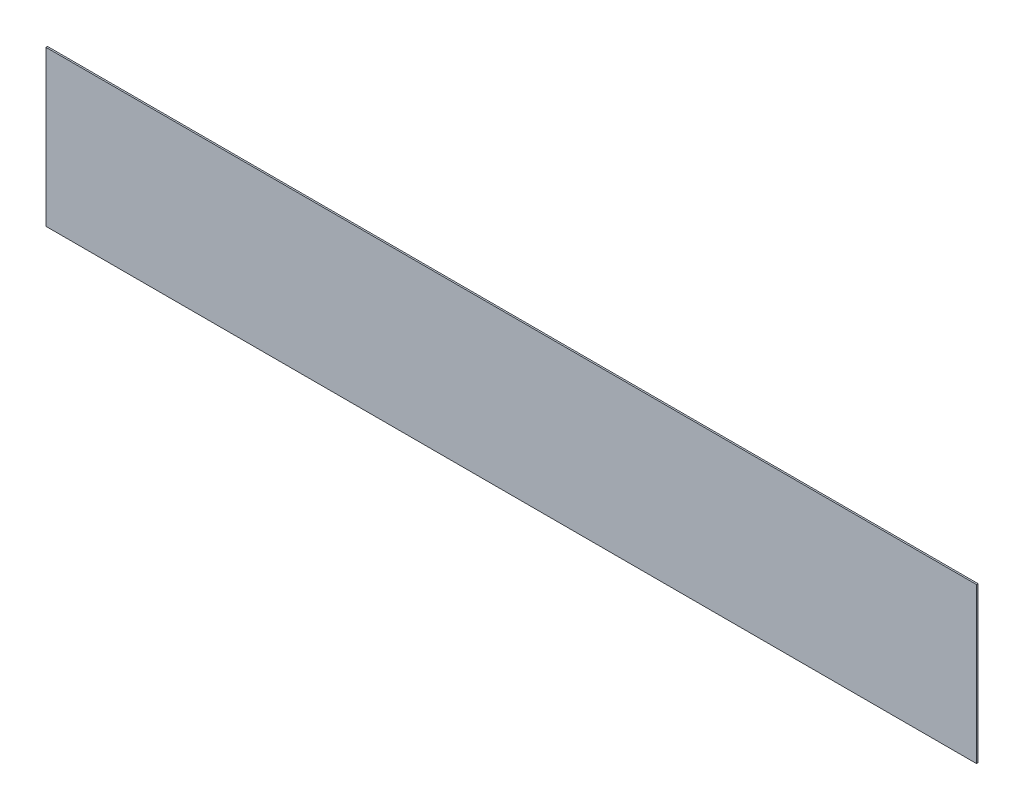
ISO-10303-21;
HEADER;
FILE_DESCRIPTION(('STEP AP214'),'2;1');
FILE_NAME('part.step','',(''),(''),'','','');
FILE_SCHEMA(('AUTOMOTIVE_DESIGN { 1 0 10303 214 1 1 1 1 }'));
ENDSEC;
DATA;
#1=APPLICATION_CONTEXT('core data for automotive mechanical design processes');
#2=APPLICATION_PROTOCOL_DEFINITION('international standard','automotive_design',2000,#1);
#3=PRODUCT_CONTEXT('',#1,'mechanical');
#4=PRODUCT('Part','Part','',(#3));
#5=PRODUCT_RELATED_PRODUCT_CATEGORY('part','',(#4));
#6=PRODUCT_DEFINITION_FORMATION('','',#4);
#7=PRODUCT_DEFINITION_CONTEXT('part definition',#1,'design');
#8=PRODUCT_DEFINITION('design','',#6,#7);
#9=PRODUCT_DEFINITION_SHAPE('','',#8);
#10=(LENGTH_UNIT() NAMED_UNIT(*) SI_UNIT(.MILLI.,.METRE.));
#11=(NAMED_UNIT(*) PLANE_ANGLE_UNIT() SI_UNIT($,.RADIAN.));
#12=(NAMED_UNIT(*) SI_UNIT($,.STERADIAN.) SOLID_ANGLE_UNIT());
#13=UNCERTAINTY_MEASURE_WITH_UNIT(LENGTH_MEASURE(1.E-05),#10,'distance_accuracy_value','');
#14=(GEOMETRIC_REPRESENTATION_CONTEXT(3) GLOBAL_UNCERTAINTY_ASSIGNED_CONTEXT((#13)) GLOBAL_UNIT_ASSIGNED_CONTEXT((#10,
#11,#12)) REPRESENTATION_CONTEXT('',''));
#15=CARTESIAN_POINT('',(0.,0.,0.));
#16=DIRECTION('',(0.,0.,1.));
#17=DIRECTION('',(1.,0.,0.));
#18=AXIS2_PLACEMENT_3D('',#15,#16,#17);
#19=CARTESIAN_POINT('',(-3000.,-500.,10.));
#20=DIRECTION('',(0.,1.,0.));
#21=DIRECTION('',(0.,0.,1.));
#22=AXIS2_PLACEMENT_3D('',#19,#20,#21);
#23=PLANE('',#22);
#24=DIRECTION('',(1.,0.,0.));
#25=VECTOR('',#24,1.);
#26=CARTESIAN_POINT('',(-3000.,-500.,0.));
#27=LINE('',#26,#25);
#28=CARTESIAN_POINT('',(-3000.,-500.,0.));
#29=VERTEX_POINT('',#28);
#30=CARTESIAN_POINT('',(3000.,-500.,0.));
#31=VERTEX_POINT('',#30);
#32=EDGE_CURVE('E113',#29,#31,#27,.T.);
#33=ORIENTED_EDGE('',*,*,#32,.T.);
#34=DIRECTION('',(0.,0.,-1.));
#35=VECTOR('',#34,1.);
#36=CARTESIAN_POINT('',(3000.,-500.,10.));
#37=LINE('',#36,#35);
#38=CARTESIAN_POINT('',(3000.,-500.,10.));
#39=VERTEX_POINT('',#38);
#40=EDGE_CURVE('E11',#39,#31,#37,.T.);
#41=ORIENTED_EDGE('',*,*,#40,.F.);
#42=DIRECTION('',(1.,0.,0.));
#43=VECTOR('',#42,1.);
#44=CARTESIAN_POINT('',(-3000.,-500.,10.));
#45=LINE('',#44,#43);
#46=CARTESIAN_POINT('',(-3000.,-500.,10.));
#47=VERTEX_POINT('',#46);
#48=EDGE_CURVE('E95',#47,#39,#45,.T.);
#49=ORIENTED_EDGE('',*,*,#48,.F.);
#50=DIRECTION('',(0.,0.,-1.));
#51=VECTOR('',#50,1.);
#52=CARTESIAN_POINT('',(-3000.,-500.,10.));
#53=LINE('',#52,#51);
#54=EDGE_CURVE('E62',#47,#29,#53,.T.);
#55=ORIENTED_EDGE('',*,*,#54,.T.);
#56=EDGE_LOOP('',(#33,#41,#49,#55));
#57=FACE_BOUND('',#56,.T.);
#58=ADVANCED_FACE('F45',(#57),#23,.F.);
#59=CARTESIAN_POINT('',(3000.,-500.,10.));
#60=DIRECTION('',(-1.,0.,0.));
#61=DIRECTION('',(0.,0.,1.));
#62=AXIS2_PLACEMENT_3D('',#59,#60,#61);
#63=PLANE('',#62);
#64=DIRECTION('',(0.,1.,0.));
#65=VECTOR('',#64,1.);
#66=CARTESIAN_POINT('',(3000.,-500.,0.));
#67=LINE('',#66,#65);
#68=CARTESIAN_POINT('',(3000.,500.,0.));
#69=VERTEX_POINT('',#68);
#70=EDGE_CURVE('E101',#31,#69,#67,.T.);
#71=ORIENTED_EDGE('',*,*,#70,.T.);
#72=DIRECTION('',(0.,0.,-1.));
#73=VECTOR('',#72,1.);
#74=CARTESIAN_POINT('',(3000.,500.,10.));
#75=LINE('',#74,#73);
#76=CARTESIAN_POINT('',(3000.,500.,10.));
#77=VERTEX_POINT('',#76);
#78=EDGE_CURVE('E54',#77,#69,#75,.T.);
#79=ORIENTED_EDGE('',*,*,#78,.F.);
#80=DIRECTION('',(0.,1.,0.));
#81=VECTOR('',#80,1.);
#82=CARTESIAN_POINT('',(3000.,-500.,10.));
#83=LINE('',#82,#81);
#84=EDGE_CURVE('E87',#39,#77,#83,.T.);
#85=ORIENTED_EDGE('',*,*,#84,.F.);
#86=ORIENTED_EDGE('',*,*,#40,.T.);
#87=EDGE_LOOP('',(#71,#79,#85,#86));
#88=FACE_BOUND('',#87,.T.);
#89=ADVANCED_FACE('F100',(#88),#63,.F.);
#90=CARTESIAN_POINT('',(-3000.,500.,10.));
#91=DIRECTION('',(0.,1.,0.));
#92=DIRECTION('',(0.,0.,1.));
#93=AXIS2_PLACEMENT_3D('',#90,#91,#92);
#94=PLANE('',#93);
#95=DIRECTION('',(1.,0.,0.));
#96=VECTOR('',#95,1.);
#97=CARTESIAN_POINT('',(-3000.,500.,0.));
#98=LINE('',#97,#96);
#99=CARTESIAN_POINT('',(-3000.,500.,0.));
#100=VERTEX_POINT('',#99);
#101=EDGE_CURVE('E118',#100,#69,#98,.T.);
#102=ORIENTED_EDGE('',*,*,#101,.F.);
#103=DIRECTION('',(0.,0.,-1.));
#104=VECTOR('',#103,1.);
#105=CARTESIAN_POINT('',(-3000.,500.,10.));
#106=LINE('',#105,#104);
#107=CARTESIAN_POINT('',(-3000.,500.,10.));
#108=VERTEX_POINT('',#107);
#109=EDGE_CURVE('E76',#108,#100,#106,.T.);
#110=ORIENTED_EDGE('',*,*,#109,.F.);
#111=DIRECTION('',(1.,0.,0.));
#112=VECTOR('',#111,1.);
#113=CARTESIAN_POINT('',(-3000.,500.,10.));
#114=LINE('',#113,#112);
#115=EDGE_CURVE('E94',#108,#77,#114,.T.);
#116=ORIENTED_EDGE('',*,*,#115,.T.);
#117=ORIENTED_EDGE('',*,*,#78,.T.);
#118=EDGE_LOOP('',(#102,#110,#116,#117));
#119=FACE_BOUND('',#118,.T.);
#120=ADVANCED_FACE('F105',(#119),#94,.T.);
#121=CARTESIAN_POINT('',(-3000.,-500.,10.));
#122=DIRECTION('',(-1.,0.,0.));
#123=DIRECTION('',(0.,0.,1.));
#124=AXIS2_PLACEMENT_3D('',#121,#122,#123);
#125=PLANE('',#124);
#126=DIRECTION('',(0.,1.,0.));
#127=VECTOR('',#126,1.);
#128=CARTESIAN_POINT('',(-3000.,-500.,0.));
#129=LINE('',#128,#127);
#130=EDGE_CURVE('E121',#29,#100,#129,.T.);
#131=ORIENTED_EDGE('',*,*,#130,.F.);
#132=ORIENTED_EDGE('',*,*,#54,.F.);
#133=DIRECTION('',(0.,1.,0.));
#134=VECTOR('',#133,1.);
#135=CARTESIAN_POINT('',(-3000.,-500.,10.));
#136=LINE('',#135,#134);
#137=EDGE_CURVE('E107',#47,#108,#136,.T.);
#138=ORIENTED_EDGE('',*,*,#137,.T.);
#139=ORIENTED_EDGE('',*,*,#109,.T.);
#140=EDGE_LOOP('',(#131,#132,#138,#139));
#141=FACE_BOUND('',#140,.T.);
#142=ADVANCED_FACE('F131',(#141),#125,.T.);
#143=CARTESIAN_POINT('',(0.,0.,10.));
#144=DIRECTION('',(0.,0.,1.));
#145=DIRECTION('',(1.,0.,0.));
#146=AXIS2_PLACEMENT_3D('',#143,#144,#145);
#147=PLANE('',#146);
#148=ORIENTED_EDGE('',*,*,#48,.T.);
#149=ORIENTED_EDGE('',*,*,#84,.T.);
#150=ORIENTED_EDGE('',*,*,#115,.F.);
#151=ORIENTED_EDGE('',*,*,#137,.F.);
#152=EDGE_LOOP('',(#148,#149,#150,#151));
#153=FACE_BOUND('',#152,.T.);
#154=ADVANCED_FACE('F91',(#153),#147,.T.);
#155=CARTESIAN_POINT('',(0.,0.,0.));
#156=DIRECTION('',(0.,0.,1.));
#157=DIRECTION('',(1.,0.,0.));
#158=AXIS2_PLACEMENT_3D('',#155,#156,#157);
#159=PLANE('',#158);
#160=ORIENTED_EDGE('',*,*,#32,.F.);
#161=ORIENTED_EDGE('',*,*,#130,.T.);
#162=ORIENTED_EDGE('',*,*,#101,.T.);
#163=ORIENTED_EDGE('',*,*,#70,.F.);
#164=EDGE_LOOP('',(#160,#161,#162,#163));
#165=FACE_BOUND('',#164,.T.);
#166=ADVANCED_FACE('F130',(#165),#159,.F.);
#167=CLOSED_SHELL('',(#58,#89,#120,#142,#154,#166));
#168=MANIFOLD_SOLID_BREP('B2',#167);
#169=ADVANCED_BREP_SHAPE_REPRESENTATION('',(#18,#168),#14);
#170=SHAPE_DEFINITION_REPRESENTATION(#9,#169);
ENDSEC;
END-ISO-10303-21;
